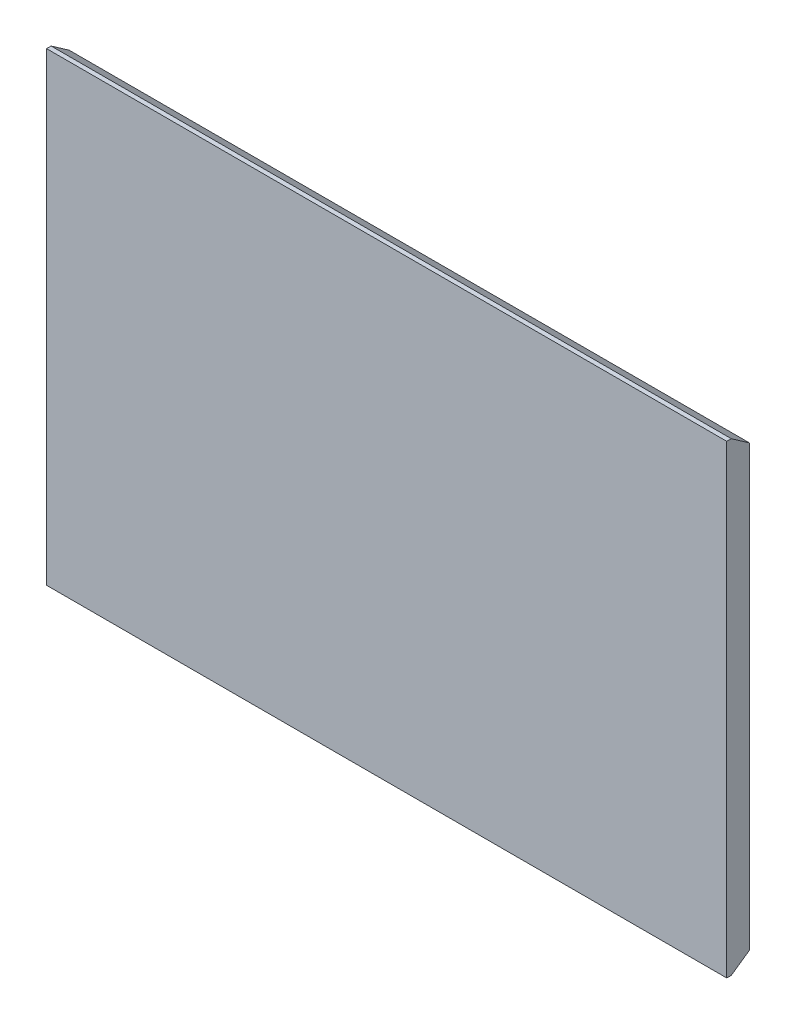
ISO-10303-21;
HEADER;
FILE_DESCRIPTION(('STEP AP214'),'2;1');
FILE_NAME('part.step','',(''),(''),'','','');
FILE_SCHEMA(('AUTOMOTIVE_DESIGN { 1 0 10303 214 1 1 1 1 }'));
ENDSEC;
DATA;
#1=APPLICATION_CONTEXT('core data for automotive mechanical design processes');
#2=APPLICATION_PROTOCOL_DEFINITION('international standard','automotive_design',2000,#1);
#3=PRODUCT_CONTEXT('',#1,'mechanical');
#4=PRODUCT('Part','Part','',(#3));
#5=PRODUCT_RELATED_PRODUCT_CATEGORY('part','',(#4));
#6=PRODUCT_DEFINITION_FORMATION('','',#4);
#7=PRODUCT_DEFINITION_CONTEXT('part definition',#1,'design');
#8=PRODUCT_DEFINITION('design','',#6,#7);
#9=PRODUCT_DEFINITION_SHAPE('','',#8);
#10=(LENGTH_UNIT() NAMED_UNIT(*) SI_UNIT(.MILLI.,.METRE.));
#11=(NAMED_UNIT(*) PLANE_ANGLE_UNIT() SI_UNIT($,.RADIAN.));
#12=(NAMED_UNIT(*) SI_UNIT($,.STERADIAN.) SOLID_ANGLE_UNIT());
#13=UNCERTAINTY_MEASURE_WITH_UNIT(LENGTH_MEASURE(1.E-05),#10,'distance_accuracy_value','');
#14=(GEOMETRIC_REPRESENTATION_CONTEXT(3) GLOBAL_UNCERTAINTY_ASSIGNED_CONTEXT((#13)) GLOBAL_UNIT_ASSIGNED_CONTEXT((#10,
#11,#12)) REPRESENTATION_CONTEXT('',''));
#15=CARTESIAN_POINT('',(0.,0.,0.));
#16=DIRECTION('',(0.,0.,1.));
#17=DIRECTION('',(1.,0.,0.));
#18=AXIS2_PLACEMENT_3D('',#15,#16,#17);
#19=CARTESIAN_POINT('',(150.,102.5,-10.));
#20=DIRECTION('',(1.,0.,0.));
#21=DIRECTION('',(0.,1.,0.));
#22=AXIS2_PLACEMENT_3D('',#19,#20,#21);
#23=PLANE('',#22);
#24=DIRECTION('',(0.,0.,1.));
#25=VECTOR('',#24,1.);
#26=CARTESIAN_POINT('',(150.,-102.5,-10.));
#27=LINE('',#26,#25);
#28=CARTESIAN_POINT('',(150.,-102.5,-1.99999999999988));
#29=VERTEX_POINT('',#28);
#30=CARTESIAN_POINT('',(150.,-102.5,0.));
#31=VERTEX_POINT('',#30);
#32=EDGE_CURVE('E120',#29,#31,#27,.T.);
#33=ORIENTED_EDGE('',*,*,#32,.F.);
#34=DIRECTION('',(0.,0.573576436351043,-0.819152044288994));
#35=VECTOR('',#34,1.);
#36=CARTESIAN_POINT('',(150.,-31.2982942077381,-103.686574203858));
#37=LINE('',#36,#35);
#38=CARTESIAN_POINT('',(150.,-96.8983396943222,-10.));
#39=VERTEX_POINT('',#38);
#40=EDGE_CURVE('E59',#29,#39,#37,.T.);
#41=ORIENTED_EDGE('',*,*,#40,.T.);
#42=DIRECTION('',(0.,1.,0.));
#43=VECTOR('',#42,1.);
#44=CARTESIAN_POINT('',(150.,102.5,-10.));
#45=LINE('',#44,#43);
#46=CARTESIAN_POINT('',(150.,96.8983396943223,-10.));
#47=VERTEX_POINT('',#46);
#48=EDGE_CURVE('E119',#39,#47,#45,.T.);
#49=ORIENTED_EDGE('',*,*,#48,.T.);
#50=DIRECTION('',(0.,0.573576436351044,0.819152044288994));
#51=VECTOR('',#50,1.);
#52=CARTESIAN_POINT('',(150.,98.7412295168564,-7.36808057330268));
#53=LINE('',#52,#51);
#54=CARTESIAN_POINT('',(150.,102.5,-1.99999999999994));
#55=VERTEX_POINT('',#54);
#56=EDGE_CURVE('E94',#47,#55,#53,.T.);
#57=ORIENTED_EDGE('',*,*,#56,.T.);
#58=DIRECTION('',(0.,0.,1.));
#59=VECTOR('',#58,1.);
#60=CARTESIAN_POINT('',(150.,102.5,-10.));
#61=LINE('',#60,#59);
#62=CARTESIAN_POINT('',(150.,102.5,0.));
#63=VERTEX_POINT('',#62);
#64=EDGE_CURVE('E88',#55,#63,#61,.T.);
#65=ORIENTED_EDGE('',*,*,#64,.T.);
#66=DIRECTION('',(0.,1.,0.));
#67=VECTOR('',#66,1.);
#68=CARTESIAN_POINT('',(150.,102.5,0.));
#69=LINE('',#68,#67);
#70=EDGE_CURVE('E91',#31,#63,#69,.T.);
#71=ORIENTED_EDGE('',*,*,#70,.F.);
#72=EDGE_LOOP('',(#33,#41,#49,#57,#65,#71));
#73=FACE_BOUND('',#72,.T.);
#74=ADVANCED_FACE('F37',(#73),#23,.T.);
#75=CARTESIAN_POINT('',(-150.,-102.5,-10.));
#76=DIRECTION('',(0.,-1.,0.));
#77=DIRECTION('',(0.,0.,-1.));
#78=AXIS2_PLACEMENT_3D('',#75,#76,#77);
#79=PLANE('',#78);
#80=DIRECTION('',(0.,0.,1.));
#81=VECTOR('',#80,1.);
#82=CARTESIAN_POINT('',(-150.,-102.5,-10.));
#83=LINE('',#82,#81);
#84=CARTESIAN_POINT('',(-150.,-102.5,-1.99999999999988));
#85=VERTEX_POINT('',#84);
#86=CARTESIAN_POINT('',(-150.,-102.5,0.));
#87=VERTEX_POINT('',#86);
#88=EDGE_CURVE('E123',#85,#87,#83,.T.);
#89=ORIENTED_EDGE('',*,*,#88,.F.);
#90=DIRECTION('',(1.,0.,0.));
#91=VECTOR('',#90,1.);
#92=CARTESIAN_POINT('',(150.,-102.5,-1.99999999999988));
#93=LINE('',#92,#91);
#94=EDGE_CURVE('E133',#85,#29,#93,.T.);
#95=ORIENTED_EDGE('',*,*,#94,.T.);
#96=ORIENTED_EDGE('',*,*,#32,.T.);
#97=DIRECTION('',(1.,0.,0.));
#98=VECTOR('',#97,1.);
#99=CARTESIAN_POINT('',(-150.,-102.5,0.));
#100=LINE('',#99,#98);
#101=EDGE_CURVE('E112',#87,#31,#100,.T.);
#102=ORIENTED_EDGE('',*,*,#101,.F.);
#103=EDGE_LOOP('',(#89,#95,#96,#102));
#104=FACE_BOUND('',#103,.T.);
#105=ADVANCED_FACE('F139',(#104),#79,.T.);
#106=CARTESIAN_POINT('',(-150.,102.5,-10.));
#107=DIRECTION('',(-1.,0.,0.));
#108=DIRECTION('',(0.,0.,1.));
#109=AXIS2_PLACEMENT_3D('',#106,#107,#108);
#110=PLANE('',#109);
#111=DIRECTION('',(0.,-1.,0.));
#112=VECTOR('',#111,1.);
#113=CARTESIAN_POINT('',(-150.,102.5,-10.));
#114=LINE('',#113,#112);
#115=CARTESIAN_POINT('',(-150.,96.8983396943223,-10.));
#116=VERTEX_POINT('',#115);
#117=CARTESIAN_POINT('',(-150.,-96.8983396943222,-10.));
#118=VERTEX_POINT('',#117);
#119=EDGE_CURVE('E99',#116,#118,#114,.T.);
#120=ORIENTED_EDGE('',*,*,#119,.T.);
#121=DIRECTION('',(0.,-0.573576436351043,0.819152044288994));
#122=VECTOR('',#121,1.);
#123=CARTESIAN_POINT('',(-150.,-31.2982942077381,-103.686574203858));
#124=LINE('',#123,#122);
#125=EDGE_CURVE('E11',#118,#85,#124,.T.);
#126=ORIENTED_EDGE('',*,*,#125,.T.);
#127=ORIENTED_EDGE('',*,*,#88,.T.);
#128=DIRECTION('',(0.,-1.,0.));
#129=VECTOR('',#128,1.);
#130=CARTESIAN_POINT('',(-150.,102.5,0.));
#131=LINE('',#130,#129);
#132=CARTESIAN_POINT('',(-150.,102.5,0.));
#133=VERTEX_POINT('',#132);
#134=EDGE_CURVE('E108',#133,#87,#131,.T.);
#135=ORIENTED_EDGE('',*,*,#134,.F.);
#136=DIRECTION('',(0.,0.,1.));
#137=VECTOR('',#136,1.);
#138=CARTESIAN_POINT('',(-150.,102.5,-10.));
#139=LINE('',#138,#137);
#140=CARTESIAN_POINT('',(-150.,102.5,-1.99999999999994));
#141=VERTEX_POINT('',#140);
#142=EDGE_CURVE('E98',#141,#133,#139,.T.);
#143=ORIENTED_EDGE('',*,*,#142,.F.);
#144=DIRECTION('',(0.,-0.573576436351044,-0.819152044288994));
#145=VECTOR('',#144,1.);
#146=CARTESIAN_POINT('',(-150.,98.7412295168564,-7.36808057330268));
#147=LINE('',#146,#145);
#148=EDGE_CURVE('E127',#141,#116,#147,.T.);
#149=ORIENTED_EDGE('',*,*,#148,.T.);
#150=EDGE_LOOP('',(#120,#126,#127,#135,#143,#149));
#151=FACE_BOUND('',#150,.T.);
#152=ADVANCED_FACE('F143',(#151),#110,.T.);
#153=CARTESIAN_POINT('',(-150.,102.5,-10.));
#154=DIRECTION('',(0.,1.,0.));
#155=DIRECTION('',(0.,0.,1.));
#156=AXIS2_PLACEMENT_3D('',#153,#154,#155);
#157=PLANE('',#156);
#158=ORIENTED_EDGE('',*,*,#64,.F.);
#159=DIRECTION('',(-1.,0.,0.));
#160=VECTOR('',#159,1.);
#161=CARTESIAN_POINT('',(-150.,102.5,-1.99999999999994));
#162=LINE('',#161,#160);
#163=EDGE_CURVE('E122',#55,#141,#162,.T.);
#164=ORIENTED_EDGE('',*,*,#163,.T.);
#165=ORIENTED_EDGE('',*,*,#142,.T.);
#166=DIRECTION('',(-1.,0.,0.));
#167=VECTOR('',#166,1.);
#168=CARTESIAN_POINT('',(-150.,102.5,0.));
#169=LINE('',#168,#167);
#170=EDGE_CURVE('E102',#63,#133,#169,.T.);
#171=ORIENTED_EDGE('',*,*,#170,.F.);
#172=EDGE_LOOP('',(#158,#164,#165,#171));
#173=FACE_BOUND('',#172,.T.);
#174=ADVANCED_FACE('F103',(#173),#157,.T.);
#175=CARTESIAN_POINT('',(0.,0.,-10.));
#176=DIRECTION('',(0.,0.,1.));
#177=DIRECTION('',(1.,0.,0.));
#178=AXIS2_PLACEMENT_3D('',#175,#176,#177);
#179=PLANE('',#178);
#180=ORIENTED_EDGE('',*,*,#48,.F.);
#181=DIRECTION('',(-1.,0.,0.));
#182=VECTOR('',#181,1.);
#183=CARTESIAN_POINT('',(-150.,-96.8983396943222,-10.));
#184=LINE('',#183,#182);
#185=EDGE_CURVE('E45',#39,#118,#184,.T.);
#186=ORIENTED_EDGE('',*,*,#185,.T.);
#187=ORIENTED_EDGE('',*,*,#119,.F.);
#188=DIRECTION('',(1.,0.,0.));
#189=VECTOR('',#188,1.);
#190=CARTESIAN_POINT('',(150.,96.8983396943223,-10.));
#191=LINE('',#190,#189);
#192=EDGE_CURVE('E129',#116,#47,#191,.T.);
#193=ORIENTED_EDGE('',*,*,#192,.T.);
#194=EDGE_LOOP('',(#180,#186,#187,#193));
#195=FACE_BOUND('',#194,.T.);
#196=ADVANCED_FACE('F145',(#195),#179,.F.);
#197=CARTESIAN_POINT('',(0.,0.,0.));
#198=DIRECTION('',(0.,0.,1.));
#199=DIRECTION('',(1.,0.,0.));
#200=AXIS2_PLACEMENT_3D('',#197,#198,#199);
#201=PLANE('',#200);
#202=ORIENTED_EDGE('',*,*,#70,.T.);
#203=ORIENTED_EDGE('',*,*,#170,.T.);
#204=ORIENTED_EDGE('',*,*,#134,.T.);
#205=ORIENTED_EDGE('',*,*,#101,.T.);
#206=EDGE_LOOP('',(#202,#203,#204,#205));
#207=FACE_BOUND('',#206,.T.);
#208=ADVANCED_FACE('F110',(#207),#201,.T.);
#209=CARTESIAN_POINT('',(-150.,102.5,-1.99999999999994));
#210=DIRECTION('',(0.,0.819152044288994,-0.573576436351044));
#211=DIRECTION('',(1.,0.,0.));
#212=AXIS2_PLACEMENT_3D('',#209,#210,#211);
#213=PLANE('',#212);
#214=ORIENTED_EDGE('',*,*,#56,.F.);
#215=ORIENTED_EDGE('',*,*,#192,.F.);
#216=ORIENTED_EDGE('',*,*,#148,.F.);
#217=ORIENTED_EDGE('',*,*,#163,.F.);
#218=EDGE_LOOP('',(#214,#215,#216,#217));
#219=FACE_BOUND('',#218,.T.);
#220=ADVANCED_FACE('F147',(#219),#213,.T.);
#221=CARTESIAN_POINT('',(-150.,-102.5,-1.99999999999988));
#222=DIRECTION('',(0.,-0.819152044288994,-0.573576436351043));
#223=DIRECTION('',(-1.,0.,0.));
#224=AXIS2_PLACEMENT_3D('',#221,#222,#223);
#225=PLANE('',#224);
#226=ORIENTED_EDGE('',*,*,#125,.F.);
#227=ORIENTED_EDGE('',*,*,#185,.F.);
#228=ORIENTED_EDGE('',*,*,#40,.F.);
#229=ORIENTED_EDGE('',*,*,#94,.F.);
#230=EDGE_LOOP('',(#226,#227,#228,#229));
#231=FACE_BOUND('',#230,.T.);
#232=ADVANCED_FACE('F39',(#231),#225,.T.);
#233=CLOSED_SHELL('',(#74,#105,#152,#174,#196,#208,#220,#232));
#234=MANIFOLD_SOLID_BREP('B2',#233);
#235=ADVANCED_BREP_SHAPE_REPRESENTATION('',(#18,#234),#14);
#236=SHAPE_DEFINITION_REPRESENTATION(#9,#235);
ENDSEC;
END-ISO-10303-21;
